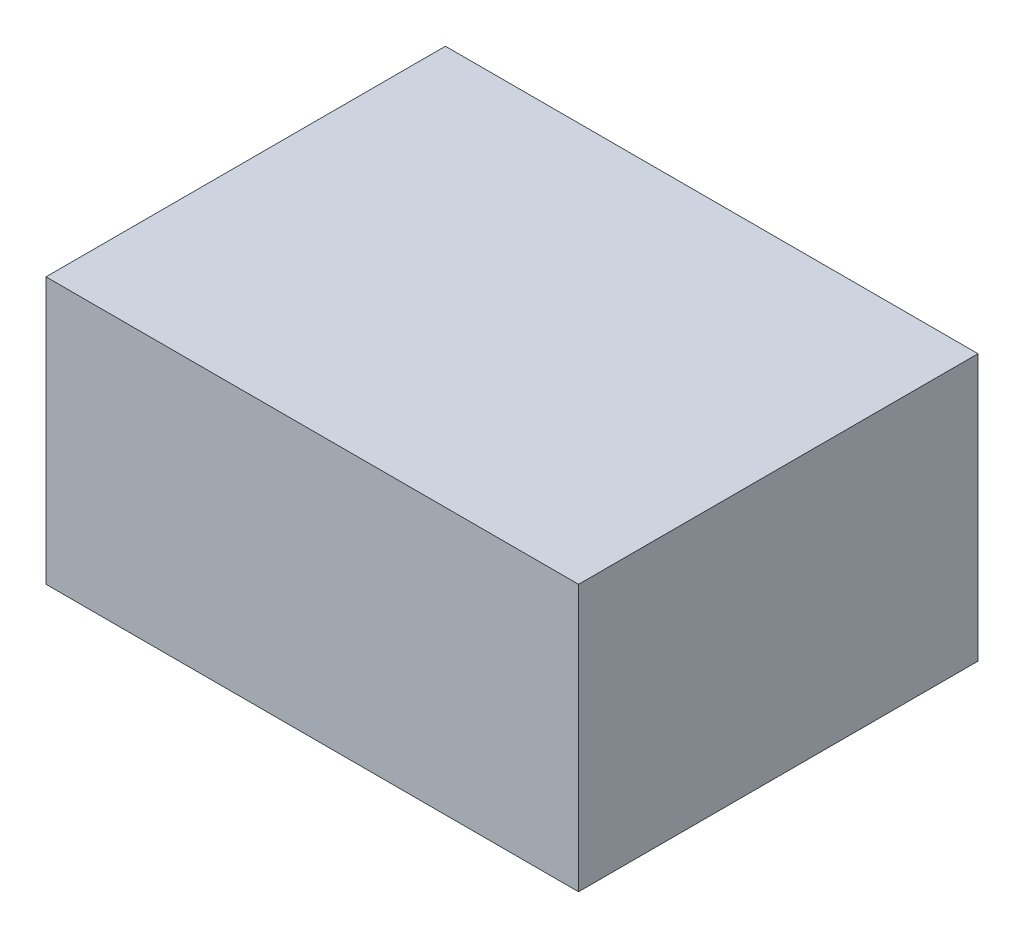
ISO-10303-21;
HEADER;
FILE_DESCRIPTION(('STEP AP214'),'2;1');
FILE_NAME('part.step','',(''),(''),'','','');
FILE_SCHEMA(('AUTOMOTIVE_DESIGN { 1 0 10303 214 1 1 1 1 }'));
ENDSEC;
DATA;
#1=APPLICATION_CONTEXT('core data for automotive mechanical design processes');
#2=APPLICATION_PROTOCOL_DEFINITION('international standard','automotive_design',2000,#1);
#3=PRODUCT_CONTEXT('',#1,'mechanical');
#4=PRODUCT('Part','Part','',(#3));
#5=PRODUCT_RELATED_PRODUCT_CATEGORY('part','',(#4));
#6=PRODUCT_DEFINITION_FORMATION('','',#4);
#7=PRODUCT_DEFINITION_CONTEXT('part definition',#1,'design');
#8=PRODUCT_DEFINITION('design','',#6,#7);
#9=PRODUCT_DEFINITION_SHAPE('','',#8);
#10=(LENGTH_UNIT() NAMED_UNIT(*) SI_UNIT(.MILLI.,.METRE.));
#11=(NAMED_UNIT(*) PLANE_ANGLE_UNIT() SI_UNIT($,.RADIAN.));
#12=(NAMED_UNIT(*) SI_UNIT($,.STERADIAN.) SOLID_ANGLE_UNIT());
#13=UNCERTAINTY_MEASURE_WITH_UNIT(LENGTH_MEASURE(1.E-05),#10,'distance_accuracy_value','');
#14=(GEOMETRIC_REPRESENTATION_CONTEXT(3) GLOBAL_UNCERTAINTY_ASSIGNED_CONTEXT((#13)) GLOBAL_UNIT_ASSIGNED_CONTEXT((#10,
#11,#12)) REPRESENTATION_CONTEXT('',''));
#15=CARTESIAN_POINT('',(0.,0.,0.));
#16=DIRECTION('',(0.,0.,1.));
#17=DIRECTION('',(1.,0.,0.));
#18=AXIS2_PLACEMENT_3D('',#15,#16,#17);
#19=CARTESIAN_POINT('',(0.,30.,0.));
#20=DIRECTION('',(1.,0.,0.));
#21=DIRECTION('',(0.,0.,-1.));
#22=AXIS2_PLACEMENT_3D('',#19,#20,#21);
#23=PLANE('',#22);
#24=DIRECTION('',(0.,0.,1.));
#25=VECTOR('',#24,1.);
#26=CARTESIAN_POINT('',(0.,0.,0.));
#27=LINE('',#26,#25);
#28=CARTESIAN_POINT('',(0.,0.,-45.));
#29=VERTEX_POINT('',#28);
#30=CARTESIAN_POINT('',(0.,0.,0.));
#31=VERTEX_POINT('',#30);
#32=EDGE_CURVE('E96',#29,#31,#27,.T.);
#33=ORIENTED_EDGE('',*,*,#32,.T.);
#34=DIRECTION('',(0.,-1.,0.));
#35=VECTOR('',#34,1.);
#36=CARTESIAN_POINT('',(0.,30.,0.));
#37=LINE('',#36,#35);
#38=CARTESIAN_POINT('',(0.,30.,0.));
#39=VERTEX_POINT('',#38);
#40=EDGE_CURVE('E11',#39,#31,#37,.T.);
#41=ORIENTED_EDGE('',*,*,#40,.F.);
#42=DIRECTION('',(0.,0.,1.));
#43=VECTOR('',#42,1.);
#44=CARTESIAN_POINT('',(0.,30.,0.));
#45=LINE('',#44,#43);
#46=CARTESIAN_POINT('',(0.,30.,-45.));
#47=VERTEX_POINT('',#46);
#48=EDGE_CURVE('E84',#47,#39,#45,.T.);
#49=ORIENTED_EDGE('',*,*,#48,.F.);
#50=DIRECTION('',(0.,-1.,0.));
#51=VECTOR('',#50,1.);
#52=CARTESIAN_POINT('',(0.,30.,-45.));
#53=LINE('',#52,#51);
#54=EDGE_CURVE('E92',#47,#29,#53,.T.);
#55=ORIENTED_EDGE('',*,*,#54,.T.);
#56=EDGE_LOOP('',(#33,#41,#49,#55));
#57=FACE_BOUND('',#56,.T.);
#58=ADVANCED_FACE('F33',(#57),#23,.F.);
#59=CARTESIAN_POINT('',(0.,30.,0.));
#60=DIRECTION('',(0.,0.,-1.));
#61=DIRECTION('',(-1.,0.,0.));
#62=AXIS2_PLACEMENT_3D('',#59,#60,#61);
#63=PLANE('',#62);
#64=DIRECTION('',(1.,0.,0.));
#65=VECTOR('',#64,1.);
#66=CARTESIAN_POINT('',(0.,0.,0.));
#67=LINE('',#66,#65);
#68=CARTESIAN_POINT('',(60.,0.,0.));
#69=VERTEX_POINT('',#68);
#70=EDGE_CURVE('E88',#31,#69,#67,.T.);
#71=ORIENTED_EDGE('',*,*,#70,.T.);
#72=DIRECTION('',(0.,-1.,0.));
#73=VECTOR('',#72,1.);
#74=CARTESIAN_POINT('',(60.,30.,0.));
#75=LINE('',#74,#73);
#76=CARTESIAN_POINT('',(60.,30.,0.));
#77=VERTEX_POINT('',#76);
#78=EDGE_CURVE('E41',#77,#69,#75,.T.);
#79=ORIENTED_EDGE('',*,*,#78,.F.);
#80=DIRECTION('',(1.,0.,0.));
#81=VECTOR('',#80,1.);
#82=CARTESIAN_POINT('',(0.,30.,0.));
#83=LINE('',#82,#81);
#84=EDGE_CURVE('E79',#39,#77,#83,.T.);
#85=ORIENTED_EDGE('',*,*,#84,.F.);
#86=ORIENTED_EDGE('',*,*,#40,.T.);
#87=EDGE_LOOP('',(#71,#79,#85,#86));
#88=FACE_BOUND('',#87,.T.);
#89=ADVANCED_FACE('F87',(#88),#63,.F.);
#90=CARTESIAN_POINT('',(60.,30.,0.));
#91=DIRECTION('',(-1.,0.,0.));
#92=DIRECTION('',(0.,0.,1.));
#93=AXIS2_PLACEMENT_3D('',#90,#91,#92);
#94=PLANE('',#93);
#95=DIRECTION('',(0.,0.,-1.));
#96=VECTOR('',#95,1.);
#97=CARTESIAN_POINT('',(60.,0.,0.));
#98=LINE('',#97,#96);
#99=CARTESIAN_POINT('',(60.,0.,-45.));
#100=VERTEX_POINT('',#99);
#101=EDGE_CURVE('E66',#69,#100,#98,.T.);
#102=ORIENTED_EDGE('',*,*,#101,.T.);
#103=DIRECTION('',(0.,-1.,0.));
#104=VECTOR('',#103,1.);
#105=CARTESIAN_POINT('',(60.,30.,-45.));
#106=LINE('',#105,#104);
#107=CARTESIAN_POINT('',(60.,30.,-45.));
#108=VERTEX_POINT('',#107);
#109=EDGE_CURVE('E89',#108,#100,#106,.T.);
#110=ORIENTED_EDGE('',*,*,#109,.F.);
#111=DIRECTION('',(0.,0.,-1.));
#112=VECTOR('',#111,1.);
#113=CARTESIAN_POINT('',(60.,30.,0.));
#114=LINE('',#113,#112);
#115=EDGE_CURVE('E82',#77,#108,#114,.T.);
#116=ORIENTED_EDGE('',*,*,#115,.F.);
#117=ORIENTED_EDGE('',*,*,#78,.T.);
#118=EDGE_LOOP('',(#102,#110,#116,#117));
#119=FACE_BOUND('',#118,.T.);
#120=ADVANCED_FACE('F90',(#119),#94,.F.);
#121=CARTESIAN_POINT('',(0.,30.,-45.));
#122=DIRECTION('',(0.,0.,1.));
#123=DIRECTION('',(1.,0.,0.));
#124=AXIS2_PLACEMENT_3D('',#121,#122,#123);
#125=PLANE('',#124);
#126=DIRECTION('',(-1.,0.,0.));
#127=VECTOR('',#126,1.);
#128=CARTESIAN_POINT('',(0.,0.,-45.));
#129=LINE('',#128,#127);
#130=EDGE_CURVE('E72',#100,#29,#129,.T.);
#131=ORIENTED_EDGE('',*,*,#130,.T.);
#132=ORIENTED_EDGE('',*,*,#54,.F.);
#133=DIRECTION('',(-1.,0.,0.));
#134=VECTOR('',#133,1.);
#135=CARTESIAN_POINT('',(0.,30.,-45.));
#136=LINE('',#135,#134);
#137=EDGE_CURVE('E49',#108,#47,#136,.T.);
#138=ORIENTED_EDGE('',*,*,#137,.F.);
#139=ORIENTED_EDGE('',*,*,#109,.T.);
#140=EDGE_LOOP('',(#131,#132,#138,#139));
#141=FACE_BOUND('',#140,.T.);
#142=ADVANCED_FACE('F103',(#141),#125,.F.);
#143=CARTESIAN_POINT('',(0.,30.,0.));
#144=DIRECTION('',(0.,-1.,0.));
#145=DIRECTION('',(0.,0.,-1.));
#146=AXIS2_PLACEMENT_3D('',#143,#144,#145);
#147=PLANE('',#146);
#148=ORIENTED_EDGE('',*,*,#48,.T.);
#149=ORIENTED_EDGE('',*,*,#84,.T.);
#150=ORIENTED_EDGE('',*,*,#115,.T.);
#151=ORIENTED_EDGE('',*,*,#137,.T.);
#152=EDGE_LOOP('',(#148,#149,#150,#151));
#153=FACE_BOUND('',#152,.T.);
#154=ADVANCED_FACE('F80',(#153),#147,.F.);
#155=CARTESIAN_POINT('',(0.,0.,0.));
#156=DIRECTION('',(0.,-1.,0.));
#157=DIRECTION('',(0.,0.,-1.));
#158=AXIS2_PLACEMENT_3D('',#155,#156,#157);
#159=PLANE('',#158);
#160=ORIENTED_EDGE('',*,*,#32,.F.);
#161=ORIENTED_EDGE('',*,*,#130,.F.);
#162=ORIENTED_EDGE('',*,*,#101,.F.);
#163=ORIENTED_EDGE('',*,*,#70,.F.);
#164=EDGE_LOOP('',(#160,#161,#162,#163));
#165=FACE_BOUND('',#164,.T.);
#166=ADVANCED_FACE('F106',(#165),#159,.T.);
#167=CLOSED_SHELL('',(#58,#89,#120,#142,#154,#166));
#168=MANIFOLD_SOLID_BREP('B2',#167);
#169=ADVANCED_BREP_SHAPE_REPRESENTATION('',(#18,#168),#14);
#170=SHAPE_DEFINITION_REPRESENTATION(#9,#169);
ENDSEC;
END-ISO-10303-21;
